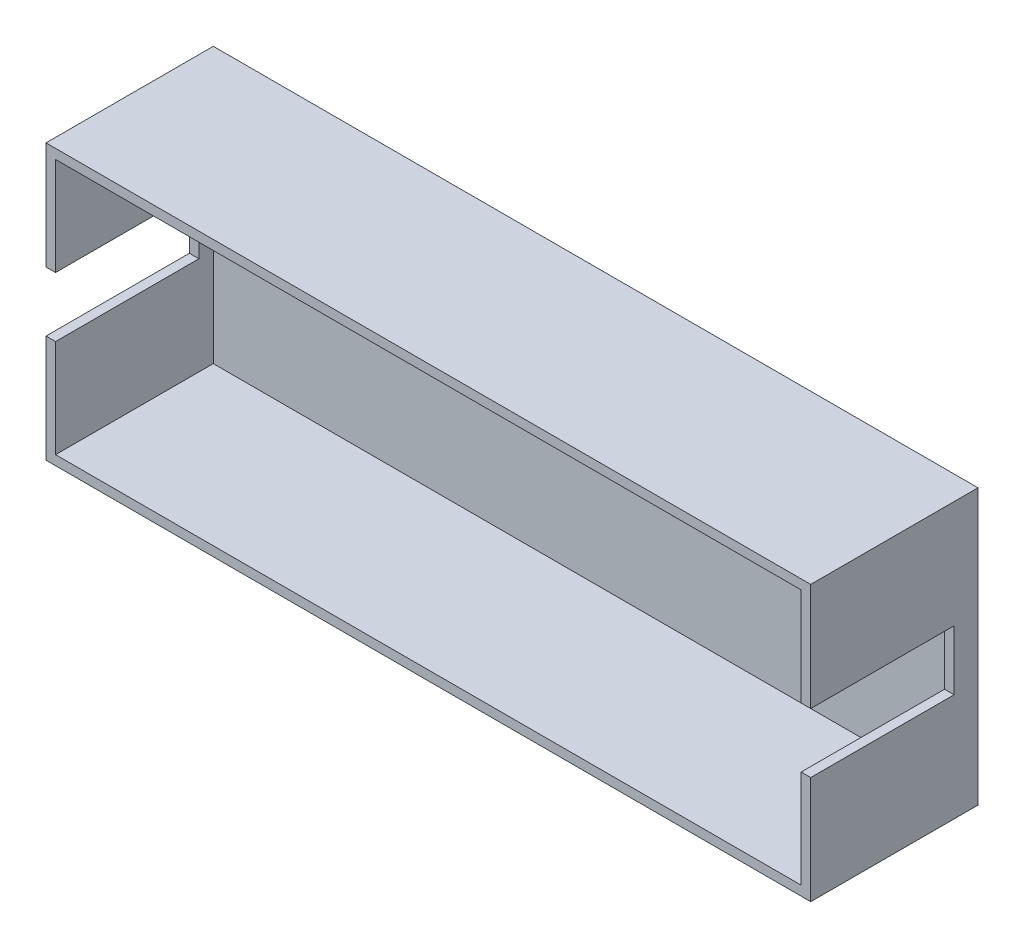
ISO-10303-21;
HEADER;
FILE_DESCRIPTION(('STEP AP214'),'2;1');
FILE_NAME('part.step','',(''),(''),'','','');
FILE_SCHEMA(('AUTOMOTIVE_DESIGN { 1 0 10303 214 1 1 1 1 }'));
ENDSEC;
DATA;
#1=APPLICATION_CONTEXT('core data for automotive mechanical design processes');
#2=APPLICATION_PROTOCOL_DEFINITION('international standard','automotive_design',2000,#1);
#3=PRODUCT_CONTEXT('',#1,'mechanical');
#4=PRODUCT('Part','Part','',(#3));
#5=PRODUCT_RELATED_PRODUCT_CATEGORY('part','',(#4));
#6=PRODUCT_DEFINITION_FORMATION('','',#4);
#7=PRODUCT_DEFINITION_CONTEXT('part definition',#1,'design');
#8=PRODUCT_DEFINITION('design','',#6,#7);
#9=PRODUCT_DEFINITION_SHAPE('','',#8);
#10=(LENGTH_UNIT() NAMED_UNIT(*) SI_UNIT(.MILLI.,.METRE.));
#11=(NAMED_UNIT(*) PLANE_ANGLE_UNIT() SI_UNIT($,.RADIAN.));
#12=(NAMED_UNIT(*) SI_UNIT($,.STERADIAN.) SOLID_ANGLE_UNIT());
#13=UNCERTAINTY_MEASURE_WITH_UNIT(LENGTH_MEASURE(1.E-05),#10,'distance_accuracy_value','');
#14=(GEOMETRIC_REPRESENTATION_CONTEXT(3) GLOBAL_UNCERTAINTY_ASSIGNED_CONTEXT((#13)) GLOBAL_UNIT_ASSIGNED_CONTEXT((#10,
#11,#12)) REPRESENTATION_CONTEXT('',''));
#15=CARTESIAN_POINT('',(0.,0.,0.));
#16=DIRECTION('',(0.,0.,1.));
#17=DIRECTION('',(1.,0.,0.));
#18=AXIS2_PLACEMENT_3D('',#15,#16,#17);
#19=CARTESIAN_POINT('',(0.,0.,14.));
#20=DIRECTION('',(0.,0.,1.));
#21=DIRECTION('',(1.,0.,0.));
#22=AXIS2_PLACEMENT_3D('',#19,#20,#21);
#23=PLANE('',#22);
#24=DIRECTION('',(1.,0.,0.));
#25=VECTOR('',#24,1.);
#26=CARTESIAN_POINT('',(0.,-2.5,14.));
#27=LINE('',#26,#25);
#28=CARTESIAN_POINT('',(-32.,-2.5,14.));
#29=VERTEX_POINT('',#28);
#30=CARTESIAN_POINT('',(-31.2,-2.5,14.));
#31=VERTEX_POINT('',#30);
#32=EDGE_CURVE('E183',#29,#31,#27,.T.);
#33=ORIENTED_EDGE('',*,*,#32,.F.);
#34=DIRECTION('',(0.,-1.,0.));
#35=VECTOR('',#34,1.);
#36=CARTESIAN_POINT('',(-32.,11.5,14.));
#37=LINE('',#36,#35);
#38=CARTESIAN_POINT('',(-32.,-11.5,14.));
#39=VERTEX_POINT('',#38);
#40=EDGE_CURVE('E235',#29,#39,#37,.T.);
#41=ORIENTED_EDGE('',*,*,#40,.T.);
#42=DIRECTION('',(1.,0.,0.));
#43=VECTOR('',#42,1.);
#44=CARTESIAN_POINT('',(-32.,-11.5,14.));
#45=LINE('',#44,#43);
#46=CARTESIAN_POINT('',(32.,-11.5,14.));
#47=VERTEX_POINT('',#46);
#48=EDGE_CURVE('E238',#39,#47,#45,.T.);
#49=ORIENTED_EDGE('',*,*,#48,.T.);
#50=DIRECTION('',(0.,1.,0.));
#51=VECTOR('',#50,1.);
#52=CARTESIAN_POINT('',(32.,11.5,14.));
#53=LINE('',#52,#51);
#54=CARTESIAN_POINT('',(32.,-2.5,14.));
#55=VERTEX_POINT('',#54);
#56=EDGE_CURVE('E229',#47,#55,#53,.T.);
#57=ORIENTED_EDGE('',*,*,#56,.T.);
#58=CARTESIAN_POINT('',(31.2,-2.5,14.));
#59=VERTEX_POINT('',#58);
#60=EDGE_CURVE('E186',#59,#55,#27,.T.);
#61=ORIENTED_EDGE('',*,*,#60,.F.);
#62=DIRECTION('',(0.,1.,0.));
#63=VECTOR('',#62,1.);
#64=CARTESIAN_POINT('',(31.2,10.7,14.));
#65=LINE('',#64,#63);
#66=CARTESIAN_POINT('',(31.2,-10.7,14.));
#67=VERTEX_POINT('',#66);
#68=EDGE_CURVE('E207',#67,#59,#65,.T.);
#69=ORIENTED_EDGE('',*,*,#68,.F.);
#70=DIRECTION('',(1.,0.,0.));
#71=VECTOR('',#70,1.);
#72=CARTESIAN_POINT('',(-31.2,-10.7,14.));
#73=LINE('',#72,#71);
#74=CARTESIAN_POINT('',(-31.2,-10.7,14.));
#75=VERTEX_POINT('',#74);
#76=EDGE_CURVE('E197',#75,#67,#73,.T.);
#77=ORIENTED_EDGE('',*,*,#76,.F.);
#78=DIRECTION('',(0.,-1.,0.));
#79=VECTOR('',#78,1.);
#80=CARTESIAN_POINT('',(-31.2,10.7,14.));
#81=LINE('',#80,#79);
#82=EDGE_CURVE('E213',#31,#75,#81,.T.);
#83=ORIENTED_EDGE('',*,*,#82,.F.);
#84=EDGE_LOOP('',(#33,#41,#49,#57,#61,#69,#77,#83));
#85=FACE_BOUND('',#84,.T.);
#86=ADVANCED_FACE('F33',(#85),#23,.T.);
#87=CARTESIAN_POINT('',(32.,11.5,14.));
#88=DIRECTION('',(-1.,0.,0.));
#89=DIRECTION('',(0.,0.,1.));
#90=AXIS2_PLACEMENT_3D('',#87,#88,#89);
#91=PLANE('',#90);
#92=DIRECTION('',(0.,1.,0.));
#93=VECTOR('',#92,1.);
#94=CARTESIAN_POINT('',(32.,2.5,2.));
#95=LINE('',#94,#93);
#96=CARTESIAN_POINT('',(32.,-2.5,2.));
#97=VERTEX_POINT('',#96);
#98=CARTESIAN_POINT('',(32.,2.5,2.));
#99=VERTEX_POINT('',#98);
#100=EDGE_CURVE('E174',#97,#99,#95,.T.);
#101=ORIENTED_EDGE('',*,*,#100,.F.);
#102=DIRECTION('',(0.,0.,-1.));
#103=VECTOR('',#102,1.);
#104=CARTESIAN_POINT('',(32.,-2.5,26.));
#105=LINE('',#104,#103);
#106=EDGE_CURVE('E167',#55,#97,#105,.T.);
#107=ORIENTED_EDGE('',*,*,#106,.F.);
#108=ORIENTED_EDGE('',*,*,#56,.F.);
#109=DIRECTION('',(0.,0.,-1.));
#110=VECTOR('',#109,1.);
#111=CARTESIAN_POINT('',(32.,-11.5,14.));
#112=LINE('',#111,#110);
#113=CARTESIAN_POINT('',(32.,-11.5,0.));
#114=VERTEX_POINT('',#113);
#115=EDGE_CURVE('E240',#47,#114,#112,.T.);
#116=ORIENTED_EDGE('',*,*,#115,.T.);
#117=DIRECTION('',(0.,1.,0.));
#118=VECTOR('',#117,1.);
#119=CARTESIAN_POINT('',(32.,11.5,0.));
#120=LINE('',#119,#118);
#121=CARTESIAN_POINT('',(32.,11.5,0.));
#122=VERTEX_POINT('',#121);
#123=EDGE_CURVE('E221',#114,#122,#120,.T.);
#124=ORIENTED_EDGE('',*,*,#123,.T.);
#125=DIRECTION('',(0.,0.,-1.));
#126=VECTOR('',#125,1.);
#127=CARTESIAN_POINT('',(32.,11.5,14.));
#128=LINE('',#127,#126);
#129=CARTESIAN_POINT('',(32.,11.5,14.));
#130=VERTEX_POINT('',#129);
#131=EDGE_CURVE('E257',#130,#122,#128,.T.);
#132=ORIENTED_EDGE('',*,*,#131,.F.);
#133=CARTESIAN_POINT('',(32.,2.5,14.));
#134=VERTEX_POINT('',#133);
#135=EDGE_CURVE('E233',#134,#130,#53,.T.);
#136=ORIENTED_EDGE('',*,*,#135,.F.);
#137=DIRECTION('',(0.,0.,1.));
#138=VECTOR('',#137,1.);
#139=CARTESIAN_POINT('',(32.,2.5,26.));
#140=LINE('',#139,#138);
#141=EDGE_CURVE('E170',#99,#134,#140,.T.);
#142=ORIENTED_EDGE('',*,*,#141,.F.);
#143=EDGE_LOOP('',(#101,#107,#108,#116,#124,#132,#136,#142));
#144=FACE_BOUND('',#143,.T.);
#145=ADVANCED_FACE('F35',(#144),#91,.F.);
#146=CARTESIAN_POINT('',(-32.,11.5,14.));
#147=DIRECTION('',(0.,-1.,0.));
#148=DIRECTION('',(0.,0.,-1.));
#149=AXIS2_PLACEMENT_3D('',#146,#147,#148);
#150=PLANE('',#149);
#151=DIRECTION('',(-1.,0.,0.));
#152=VECTOR('',#151,1.);
#153=CARTESIAN_POINT('',(-32.,11.5,0.));
#154=LINE('',#153,#152);
#155=CARTESIAN_POINT('',(-32.,11.5,0.));
#156=VERTEX_POINT('',#155);
#157=EDGE_CURVE('E243',#122,#156,#154,.T.);
#158=ORIENTED_EDGE('',*,*,#157,.T.);
#159=DIRECTION('',(0.,0.,-1.));
#160=VECTOR('',#159,1.);
#161=CARTESIAN_POINT('',(-32.,11.5,14.));
#162=LINE('',#161,#160);
#163=CARTESIAN_POINT('',(-32.,11.5,14.));
#164=VERTEX_POINT('',#163);
#165=EDGE_CURVE('E254',#164,#156,#162,.T.);
#166=ORIENTED_EDGE('',*,*,#165,.F.);
#167=DIRECTION('',(-1.,0.,0.));
#168=VECTOR('',#167,1.);
#169=CARTESIAN_POINT('',(-32.,11.5,14.));
#170=LINE('',#169,#168);
#171=EDGE_CURVE('E232',#130,#164,#170,.T.);
#172=ORIENTED_EDGE('',*,*,#171,.F.);
#173=ORIENTED_EDGE('',*,*,#131,.T.);
#174=EDGE_LOOP('',(#158,#166,#172,#173));
#175=FACE_BOUND('',#174,.T.);
#176=ADVANCED_FACE('F314',(#175),#150,.F.);
#177=CARTESIAN_POINT('',(-32.,11.5,14.));
#178=DIRECTION('',(1.,0.,0.));
#179=DIRECTION('',(0.,0.,-1.));
#180=AXIS2_PLACEMENT_3D('',#177,#178,#179);
#181=PLANE('',#180);
#182=ORIENTED_EDGE('',*,*,#40,.F.);
#183=DIRECTION('',(0.,0.,-1.));
#184=VECTOR('',#183,1.);
#185=CARTESIAN_POINT('',(-32.,-2.5,26.));
#186=LINE('',#185,#184);
#187=CARTESIAN_POINT('',(-32.,-2.5,2.));
#188=VERTEX_POINT('',#187);
#189=EDGE_CURVE('E163',#29,#188,#186,.T.);
#190=ORIENTED_EDGE('',*,*,#189,.T.);
#191=DIRECTION('',(0.,1.,0.));
#192=VECTOR('',#191,1.);
#193=CARTESIAN_POINT('',(-32.,2.5,2.));
#194=LINE('',#193,#192);
#195=CARTESIAN_POINT('',(-32.,2.5,2.));
#196=VERTEX_POINT('',#195);
#197=EDGE_CURVE('E148',#188,#196,#194,.T.);
#198=ORIENTED_EDGE('',*,*,#197,.T.);
#199=DIRECTION('',(0.,0.,1.));
#200=VECTOR('',#199,1.);
#201=CARTESIAN_POINT('',(-32.,2.5,26.));
#202=LINE('',#201,#200);
#203=CARTESIAN_POINT('',(-32.,2.5,14.));
#204=VERTEX_POINT('',#203);
#205=EDGE_CURVE('E156',#196,#204,#202,.T.);
#206=ORIENTED_EDGE('',*,*,#205,.T.);
#207=EDGE_CURVE('E236',#164,#204,#37,.T.);
#208=ORIENTED_EDGE('',*,*,#207,.F.);
#209=ORIENTED_EDGE('',*,*,#165,.T.);
#210=DIRECTION('',(0.,-1.,0.));
#211=VECTOR('',#210,1.);
#212=CARTESIAN_POINT('',(-32.,11.5,0.));
#213=LINE('',#212,#211);
#214=CARTESIAN_POINT('',(-32.,-11.5,0.));
#215=VERTEX_POINT('',#214);
#216=EDGE_CURVE('E245',#156,#215,#213,.T.);
#217=ORIENTED_EDGE('',*,*,#216,.T.);
#218=DIRECTION('',(0.,0.,-1.));
#219=VECTOR('',#218,1.);
#220=CARTESIAN_POINT('',(-32.,-11.5,14.));
#221=LINE('',#220,#219);
#222=EDGE_CURVE('E251',#39,#215,#221,.T.);
#223=ORIENTED_EDGE('',*,*,#222,.F.);
#224=EDGE_LOOP('',(#182,#190,#198,#206,#208,#209,#217,#223));
#225=FACE_BOUND('',#224,.T.);
#226=ADVANCED_FACE('F166',(#225),#181,.F.);
#227=CARTESIAN_POINT('',(-32.,-11.5,14.));
#228=DIRECTION('',(0.,1.,0.));
#229=DIRECTION('',(0.,0.,1.));
#230=AXIS2_PLACEMENT_3D('',#227,#228,#229);
#231=PLANE('',#230);
#232=DIRECTION('',(1.,0.,0.));
#233=VECTOR('',#232,1.);
#234=CARTESIAN_POINT('',(-32.,-11.5,0.));
#235=LINE('',#234,#233);
#236=EDGE_CURVE('E247',#215,#114,#235,.T.);
#237=ORIENTED_EDGE('',*,*,#236,.T.);
#238=ORIENTED_EDGE('',*,*,#115,.F.);
#239=ORIENTED_EDGE('',*,*,#48,.F.);
#240=ORIENTED_EDGE('',*,*,#222,.T.);
#241=EDGE_LOOP('',(#237,#238,#239,#240));
#242=FACE_BOUND('',#241,.T.);
#243=ADVANCED_FACE('F279',(#242),#231,.F.);
#244=DIRECTION('',(-1.,0.,0.));
#245=VECTOR('',#244,1.);
#246=CARTESIAN_POINT('',(0.,2.5,14.));
#247=LINE('',#246,#245);
#248=CARTESIAN_POINT('',(31.2,2.5,14.));
#249=VERTEX_POINT('',#248);
#250=EDGE_CURVE('E48',#134,#249,#247,.T.);
#251=ORIENTED_EDGE('',*,*,#250,.F.);
#252=ORIENTED_EDGE('',*,*,#135,.T.);
#253=ORIENTED_EDGE('',*,*,#171,.T.);
#254=ORIENTED_EDGE('',*,*,#207,.T.);
#255=CARTESIAN_POINT('',(-31.2,2.5,14.));
#256=VERTEX_POINT('',#255);
#257=EDGE_CURVE('E159',#256,#204,#247,.T.);
#258=ORIENTED_EDGE('',*,*,#257,.F.);
#259=CARTESIAN_POINT('',(-31.2,10.7,14.));
#260=VERTEX_POINT('',#259);
#261=EDGE_CURVE('E214',#260,#256,#81,.T.);
#262=ORIENTED_EDGE('',*,*,#261,.F.);
#263=DIRECTION('',(-1.,0.,0.));
#264=VECTOR('',#263,1.);
#265=CARTESIAN_POINT('',(-31.2,10.7,14.));
#266=LINE('',#265,#264);
#267=CARTESIAN_POINT('',(31.2,10.7,14.));
#268=VERTEX_POINT('',#267);
#269=EDGE_CURVE('E210',#268,#260,#266,.T.);
#270=ORIENTED_EDGE('',*,*,#269,.F.);
#271=EDGE_CURVE('E192',#249,#268,#65,.T.);
#272=ORIENTED_EDGE('',*,*,#271,.F.);
#273=EDGE_LOOP('',(#251,#252,#253,#254,#258,#262,#270,#272));
#274=FACE_BOUND('',#273,.T.);
#275=ADVANCED_FACE('F266',(#274),#23,.T.);
#276=CARTESIAN_POINT('',(0.,0.,0.));
#277=DIRECTION('',(0.,0.,1.));
#278=DIRECTION('',(1.,0.,0.));
#279=AXIS2_PLACEMENT_3D('',#276,#277,#278);
#280=PLANE('',#279);
#281=ORIENTED_EDGE('',*,*,#123,.F.);
#282=ORIENTED_EDGE('',*,*,#236,.F.);
#283=ORIENTED_EDGE('',*,*,#216,.F.);
#284=ORIENTED_EDGE('',*,*,#157,.F.);
#285=EDGE_LOOP('',(#281,#282,#283,#284));
#286=FACE_BOUND('',#285,.T.);
#287=ADVANCED_FACE('F276',(#286),#280,.F.);
#288=CARTESIAN_POINT('',(31.2,10.7,0.8));
#289=DIRECTION('',(1.,0.,0.));
#290=DIRECTION('',(0.,0.,-1.));
#291=AXIS2_PLACEMENT_3D('',#288,#289,#290);
#292=PLANE('',#291);
#293=ORIENTED_EDGE('',*,*,#68,.T.);
#294=DIRECTION('',(0.,0.,-1.));
#295=VECTOR('',#294,1.);
#296=CARTESIAN_POINT('',(31.2,-2.5,0.8));
#297=LINE('',#296,#295);
#298=CARTESIAN_POINT('',(31.2,-2.5,2.));
#299=VERTEX_POINT('',#298);
#300=EDGE_CURVE('E185',#59,#299,#297,.T.);
#301=ORIENTED_EDGE('',*,*,#300,.T.);
#302=DIRECTION('',(0.,1.,0.));
#303=VECTOR('',#302,1.);
#304=CARTESIAN_POINT('',(31.2,10.7,2.));
#305=LINE('',#304,#303);
#306=CARTESIAN_POINT('',(31.2,2.5,2.));
#307=VERTEX_POINT('',#306);
#308=EDGE_CURVE('E189',#299,#307,#305,.T.);
#309=ORIENTED_EDGE('',*,*,#308,.T.);
#310=DIRECTION('',(0.,0.,1.));
#311=VECTOR('',#310,1.);
#312=CARTESIAN_POINT('',(31.2,2.5,0.8));
#313=LINE('',#312,#311);
#314=EDGE_CURVE('E181',#307,#249,#313,.T.);
#315=ORIENTED_EDGE('',*,*,#314,.T.);
#316=ORIENTED_EDGE('',*,*,#271,.T.);
#317=DIRECTION('',(0.,0.,1.));
#318=VECTOR('',#317,1.);
#319=CARTESIAN_POINT('',(31.2,10.7,0.8));
#320=LINE('',#319,#318);
#321=CARTESIAN_POINT('',(31.2,10.7,0.8));
#322=VERTEX_POINT('',#321);
#323=EDGE_CURVE('E206',#322,#268,#320,.T.);
#324=ORIENTED_EDGE('',*,*,#323,.F.);
#325=DIRECTION('',(0.,1.,0.));
#326=VECTOR('',#325,1.);
#327=CARTESIAN_POINT('',(31.2,10.7,0.8));
#328=LINE('',#327,#326);
#329=CARTESIAN_POINT('',(31.2,-10.7,0.8));
#330=VERTEX_POINT('',#329);
#331=EDGE_CURVE('E193',#330,#322,#328,.T.);
#332=ORIENTED_EDGE('',*,*,#331,.F.);
#333=DIRECTION('',(0.,0.,1.));
#334=VECTOR('',#333,1.);
#335=CARTESIAN_POINT('',(31.2,-10.7,0.8));
#336=LINE('',#335,#334);
#337=EDGE_CURVE('E219',#330,#67,#336,.T.);
#338=ORIENTED_EDGE('',*,*,#337,.T.);
#339=EDGE_LOOP('',(#293,#301,#309,#315,#316,#324,#332,#338));
#340=FACE_BOUND('',#339,.T.);
#341=ADVANCED_FACE('F322',(#340),#292,.F.);
#342=CARTESIAN_POINT('',(-31.2,-10.7,0.8));
#343=DIRECTION('',(0.,-1.,0.));
#344=DIRECTION('',(0.,0.,-1.));
#345=AXIS2_PLACEMENT_3D('',#342,#343,#344);
#346=PLANE('',#345);
#347=ORIENTED_EDGE('',*,*,#76,.T.);
#348=ORIENTED_EDGE('',*,*,#337,.F.);
#349=DIRECTION('',(1.,0.,0.));
#350=VECTOR('',#349,1.);
#351=CARTESIAN_POINT('',(-31.2,-10.7,0.8));
#352=LINE('',#351,#350);
#353=CARTESIAN_POINT('',(-31.2,-10.7,0.8));
#354=VERTEX_POINT('',#353);
#355=EDGE_CURVE('E203',#354,#330,#352,.T.);
#356=ORIENTED_EDGE('',*,*,#355,.F.);
#357=DIRECTION('',(0.,0.,1.));
#358=VECTOR('',#357,1.);
#359=CARTESIAN_POINT('',(-31.2,-10.7,0.8));
#360=LINE('',#359,#358);
#361=EDGE_CURVE('E222',#354,#75,#360,.T.);
#362=ORIENTED_EDGE('',*,*,#361,.T.);
#363=EDGE_LOOP('',(#347,#348,#356,#362));
#364=FACE_BOUND('',#363,.T.);
#365=ADVANCED_FACE('F341',(#364),#346,.F.);
#366=CARTESIAN_POINT('',(-31.2,10.7,0.8));
#367=DIRECTION('',(-1.,0.,0.));
#368=DIRECTION('',(0.,0.,1.));
#369=AXIS2_PLACEMENT_3D('',#366,#367,#368);
#370=PLANE('',#369);
#371=DIRECTION('',(0.,-1.,0.));
#372=VECTOR('',#371,1.);
#373=CARTESIAN_POINT('',(-31.2,10.7,2.));
#374=LINE('',#373,#372);
#375=CARTESIAN_POINT('',(-31.2,2.5,2.));
#376=VERTEX_POINT('',#375);
#377=CARTESIAN_POINT('',(-31.2,-2.5,2.));
#378=VERTEX_POINT('',#377);
#379=EDGE_CURVE('E41',#376,#378,#374,.T.);
#380=ORIENTED_EDGE('',*,*,#379,.T.);
#381=DIRECTION('',(0.,0.,1.));
#382=VECTOR('',#381,1.);
#383=CARTESIAN_POINT('',(-31.2,-2.5,0.8));
#384=LINE('',#383,#382);
#385=EDGE_CURVE('E11',#378,#31,#384,.T.);
#386=ORIENTED_EDGE('',*,*,#385,.T.);
#387=ORIENTED_EDGE('',*,*,#82,.T.);
#388=ORIENTED_EDGE('',*,*,#361,.F.);
#389=DIRECTION('',(0.,-1.,0.));
#390=VECTOR('',#389,1.);
#391=CARTESIAN_POINT('',(-31.2,10.7,0.8));
#392=LINE('',#391,#390);
#393=CARTESIAN_POINT('',(-31.2,10.7,0.8));
#394=VERTEX_POINT('',#393);
#395=EDGE_CURVE('E200',#394,#354,#392,.T.);
#396=ORIENTED_EDGE('',*,*,#395,.F.);
#397=DIRECTION('',(0.,0.,1.));
#398=VECTOR('',#397,1.);
#399=CARTESIAN_POINT('',(-31.2,10.7,0.8));
#400=LINE('',#399,#398);
#401=EDGE_CURVE('E225',#394,#260,#400,.T.);
#402=ORIENTED_EDGE('',*,*,#401,.T.);
#403=ORIENTED_EDGE('',*,*,#261,.T.);
#404=DIRECTION('',(0.,0.,-1.));
#405=VECTOR('',#404,1.);
#406=CARTESIAN_POINT('',(-31.2,2.5,0.8));
#407=LINE('',#406,#405);
#408=EDGE_CURVE('E260',#256,#376,#407,.T.);
#409=ORIENTED_EDGE('',*,*,#408,.T.);
#410=EDGE_LOOP('',(#380,#386,#387,#388,#396,#402,#403,#409));
#411=FACE_BOUND('',#410,.T.);
#412=ADVANCED_FACE('F262',(#411),#370,.F.);
#413=CARTESIAN_POINT('',(-31.2,10.7,0.8));
#414=DIRECTION('',(0.,1.,0.));
#415=DIRECTION('',(0.,0.,1.));
#416=AXIS2_PLACEMENT_3D('',#413,#414,#415);
#417=PLANE('',#416);
#418=ORIENTED_EDGE('',*,*,#269,.T.);
#419=ORIENTED_EDGE('',*,*,#401,.F.);
#420=DIRECTION('',(-1.,0.,0.));
#421=VECTOR('',#420,1.);
#422=CARTESIAN_POINT('',(-31.2,10.7,0.8));
#423=LINE('',#422,#421);
#424=EDGE_CURVE('E196',#322,#394,#423,.T.);
#425=ORIENTED_EDGE('',*,*,#424,.F.);
#426=ORIENTED_EDGE('',*,*,#323,.T.);
#427=EDGE_LOOP('',(#418,#419,#425,#426));
#428=FACE_BOUND('',#427,.T.);
#429=ADVANCED_FACE('F303',(#428),#417,.F.);
#430=CARTESIAN_POINT('',(0.,0.,0.8));
#431=DIRECTION('',(0.,0.,1.));
#432=DIRECTION('',(1.,0.,0.));
#433=AXIS2_PLACEMENT_3D('',#430,#431,#432);
#434=PLANE('',#433);
#435=ORIENTED_EDGE('',*,*,#331,.T.);
#436=ORIENTED_EDGE('',*,*,#424,.T.);
#437=ORIENTED_EDGE('',*,*,#395,.T.);
#438=ORIENTED_EDGE('',*,*,#355,.T.);
#439=EDGE_LOOP('',(#435,#436,#437,#438));
#440=FACE_BOUND('',#439,.T.);
#441=ADVANCED_FACE('F294',(#440),#434,.T.);
#442=CARTESIAN_POINT('',(-32.,-2.5,26.));
#443=DIRECTION('',(0.,-1.,0.));
#444=DIRECTION('',(0.,0.,-1.));
#445=AXIS2_PLACEMENT_3D('',#442,#443,#444);
#446=PLANE('',#445);
#447=ORIENTED_EDGE('',*,*,#32,.T.);
#448=ORIENTED_EDGE('',*,*,#385,.F.);
#449=DIRECTION('',(1.,0.,0.));
#450=VECTOR('',#449,1.);
#451=CARTESIAN_POINT('',(-32.,-2.5,2.));
#452=LINE('',#451,#450);
#453=EDGE_CURVE('E178',#188,#378,#452,.T.);
#454=ORIENTED_EDGE('',*,*,#453,.F.);
#455=ORIENTED_EDGE('',*,*,#189,.F.);
#456=EDGE_LOOP('',(#447,#448,#454,#455));
#457=FACE_BOUND('',#456,.T.);
#458=ADVANCED_FACE('F292',(#457),#446,.F.);
#459=CARTESIAN_POINT('',(-32.,2.5,26.));
#460=DIRECTION('',(0.,1.,0.));
#461=DIRECTION('',(0.,0.,1.));
#462=AXIS2_PLACEMENT_3D('',#459,#460,#461);
#463=PLANE('',#462);
#464=ORIENTED_EDGE('',*,*,#257,.T.);
#465=ORIENTED_EDGE('',*,*,#205,.F.);
#466=DIRECTION('',(1.,0.,0.));
#467=VECTOR('',#466,1.);
#468=CARTESIAN_POINT('',(-32.,2.5,2.));
#469=LINE('',#468,#467);
#470=EDGE_CURVE('E56',#196,#376,#469,.T.);
#471=ORIENTED_EDGE('',*,*,#470,.T.);
#472=ORIENTED_EDGE('',*,*,#408,.F.);
#473=EDGE_LOOP('',(#464,#465,#471,#472));
#474=FACE_BOUND('',#473,.T.);
#475=ADVANCED_FACE('F157',(#474),#463,.F.);
#476=CARTESIAN_POINT('',(-32.,2.5,2.));
#477=DIRECTION('',(0.,0.,-1.));
#478=DIRECTION('',(0.,1.,0.));
#479=AXIS2_PLACEMENT_3D('',#476,#477,#478);
#480=PLANE('',#479);
#481=ORIENTED_EDGE('',*,*,#470,.F.);
#482=ORIENTED_EDGE('',*,*,#197,.F.);
#483=ORIENTED_EDGE('',*,*,#453,.T.);
#484=ORIENTED_EDGE('',*,*,#379,.F.);
#485=EDGE_LOOP('',(#481,#482,#483,#484));
#486=FACE_BOUND('',#485,.T.);
#487=ADVANCED_FACE('F145',(#486),#480,.F.);
#488=EDGE_CURVE('E152',#299,#97,#452,.T.);
#489=ORIENTED_EDGE('',*,*,#488,.T.);
#490=ORIENTED_EDGE('',*,*,#100,.T.);
#491=EDGE_CURVE('E153',#307,#99,#469,.T.);
#492=ORIENTED_EDGE('',*,*,#491,.F.);
#493=ORIENTED_EDGE('',*,*,#308,.F.);
#494=EDGE_LOOP('',(#489,#490,#492,#493));
#495=FACE_BOUND('',#494,.T.);
#496=ADVANCED_FACE('F307',(#495),#480,.F.);
#497=ORIENTED_EDGE('',*,*,#60,.T.);
#498=ORIENTED_EDGE('',*,*,#106,.T.);
#499=ORIENTED_EDGE('',*,*,#488,.F.);
#500=ORIENTED_EDGE('',*,*,#300,.F.);
#501=EDGE_LOOP('',(#497,#498,#499,#500));
#502=FACE_BOUND('',#501,.T.);
#503=ADVANCED_FACE('F296',(#502),#446,.F.);
#504=ORIENTED_EDGE('',*,*,#250,.T.);
#505=ORIENTED_EDGE('',*,*,#314,.F.);
#506=ORIENTED_EDGE('',*,*,#491,.T.);
#507=ORIENTED_EDGE('',*,*,#141,.T.);
#508=EDGE_LOOP('',(#504,#505,#506,#507));
#509=FACE_BOUND('',#508,.T.);
#510=ADVANCED_FACE('F302',(#509),#463,.F.);
#511=CLOSED_SHELL('',(#86,#145,#176,#226,#243,#275,#287,#341,#365,#412,#429,#441,#458,#475,#487,
#496,#503,#510));
#512=MANIFOLD_SOLID_BREP('B2',#511);
#513=ADVANCED_BREP_SHAPE_REPRESENTATION('',(#18,#512),#14);
#514=SHAPE_DEFINITION_REPRESENTATION(#9,#513);
ENDSEC;
END-ISO-10303-21;
